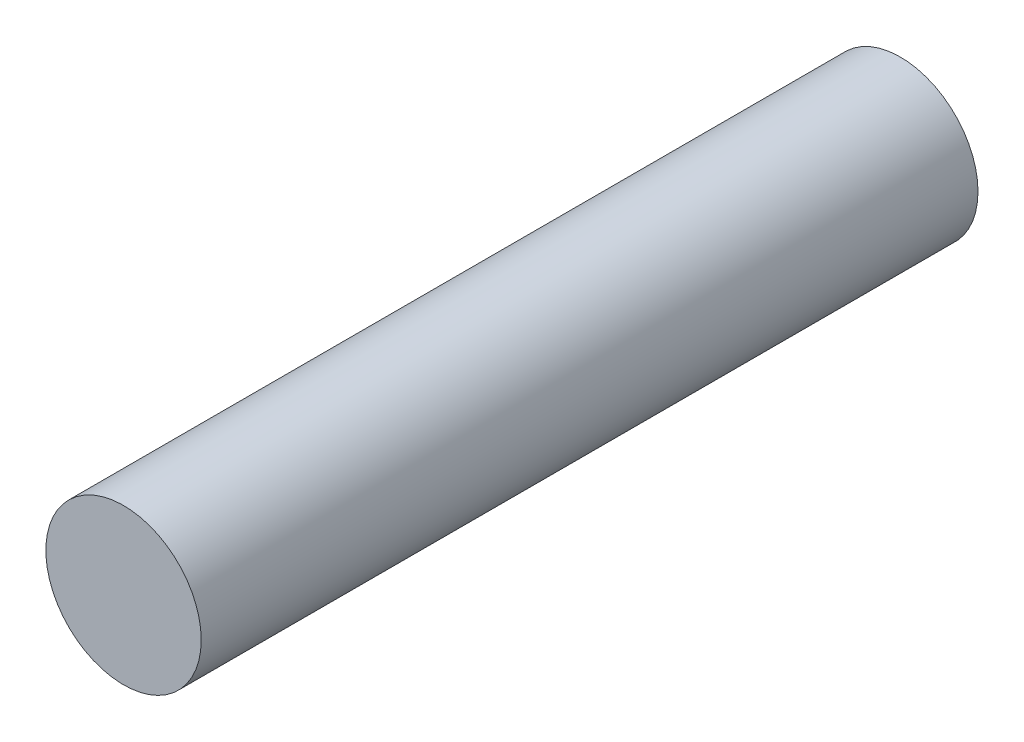
ISO-10303-21;
HEADER;
FILE_DESCRIPTION(('STEP AP214'),'2;1');
FILE_NAME('part.step','',(''),(''),'','','');
FILE_SCHEMA(('AUTOMOTIVE_DESIGN { 1 0 10303 214 1 1 1 1 }'));
ENDSEC;
DATA;
#1=APPLICATION_CONTEXT('core data for automotive mechanical design processes');
#2=APPLICATION_PROTOCOL_DEFINITION('international standard','automotive_design',2000,#1);
#3=PRODUCT_CONTEXT('',#1,'mechanical');
#4=PRODUCT('Part','Part','',(#3));
#5=PRODUCT_RELATED_PRODUCT_CATEGORY('part','',(#4));
#6=PRODUCT_DEFINITION_FORMATION('','',#4);
#7=PRODUCT_DEFINITION_CONTEXT('part definition',#1,'design');
#8=PRODUCT_DEFINITION('design','',#6,#7);
#9=PRODUCT_DEFINITION_SHAPE('','',#8);
#10=(LENGTH_UNIT() NAMED_UNIT(*) SI_UNIT(.MILLI.,.METRE.));
#11=(NAMED_UNIT(*) PLANE_ANGLE_UNIT() SI_UNIT($,.RADIAN.));
#12=(NAMED_UNIT(*) SI_UNIT($,.STERADIAN.) SOLID_ANGLE_UNIT());
#13=UNCERTAINTY_MEASURE_WITH_UNIT(LENGTH_MEASURE(1.E-05),#10,'distance_accuracy_value','');
#14=(GEOMETRIC_REPRESENTATION_CONTEXT(3) GLOBAL_UNCERTAINTY_ASSIGNED_CONTEXT((#13)) GLOBAL_UNIT_ASSIGNED_CONTEXT((#10,
#11,#12)) REPRESENTATION_CONTEXT('',''));
#15=CARTESIAN_POINT('',(0.,0.,0.));
#16=DIRECTION('',(0.,0.,1.));
#17=DIRECTION('',(1.,0.,0.));
#18=AXIS2_PLACEMENT_3D('',#15,#16,#17);
#19=CARTESIAN_POINT('',(0.,0.,1000.));
#20=DIRECTION('',(0.,0.,-1.));
#21=DIRECTION('',(-1.,0.,0.));
#22=AXIS2_PLACEMENT_3D('',#19,#20,#21);
#23=CYLINDRICAL_SURFACE('',#22,100.);
#24=CARTESIAN_POINT('',(0.,0.,1000.));
#25=DIRECTION('',(0.,0.,1.));
#26=DIRECTION('',(1.,0.,0.));
#27=AXIS2_PLACEMENT_3D('',#24,#25,#26);
#28=CIRCLE('',#27,100.);
#29=CARTESIAN_POINT('',(100.,0.,1000.));
#30=VERTEX_POINT('',#29);
#31=EDGE_CURVE('E10',#30,#30,#28,.T.);
#32=ORIENTED_EDGE('',*,*,#31,.F.);
#33=EDGE_LOOP('',(#32));
#34=FACE_BOUND('',#33,.T.);
#35=CARTESIAN_POINT('',(0.,0.,0.));
#36=DIRECTION('',(0.,0.,1.));
#37=DIRECTION('',(1.,0.,0.));
#38=AXIS2_PLACEMENT_3D('',#35,#36,#37);
#39=CIRCLE('',#38,100.);
#40=CARTESIAN_POINT('',(100.,0.,0.));
#41=VERTEX_POINT('',#40);
#42=EDGE_CURVE('E40',#41,#41,#39,.T.);
#43=ORIENTED_EDGE('',*,*,#42,.T.);
#44=EDGE_LOOP('',(#43));
#45=FACE_BOUND('',#44,.T.);
#46=ADVANCED_FACE('F37',(#34,#45),#23,.T.);
#47=CARTESIAN_POINT('',(0.,0.,1000.));
#48=DIRECTION('',(0.,0.,1.));
#49=DIRECTION('',(1.,0.,0.));
#50=AXIS2_PLACEMENT_3D('',#47,#48,#49);
#51=PLANE('',#50);
#52=ORIENTED_EDGE('',*,*,#31,.T.);
#53=EDGE_LOOP('',(#52));
#54=FACE_BOUND('',#53,.T.);
#55=ADVANCED_FACE('F54',(#54),#51,.T.);
#56=CARTESIAN_POINT('',(0.,0.,0.));
#57=DIRECTION('',(0.,0.,1.));
#58=DIRECTION('',(1.,0.,0.));
#59=AXIS2_PLACEMENT_3D('',#56,#57,#58);
#60=PLANE('',#59);
#61=ORIENTED_EDGE('',*,*,#42,.F.);
#62=EDGE_LOOP('',(#61));
#63=FACE_BOUND('',#62,.T.);
#64=ADVANCED_FACE('F52',(#63),#60,.F.);
#65=CLOSED_SHELL('',(#46,#55,#64));
#66=MANIFOLD_SOLID_BREP('B2',#65);
#67=ADVANCED_BREP_SHAPE_REPRESENTATION('',(#18,#66),#14);
#68=SHAPE_DEFINITION_REPRESENTATION(#9,#67);
ENDSEC;
END-ISO-10303-21;
